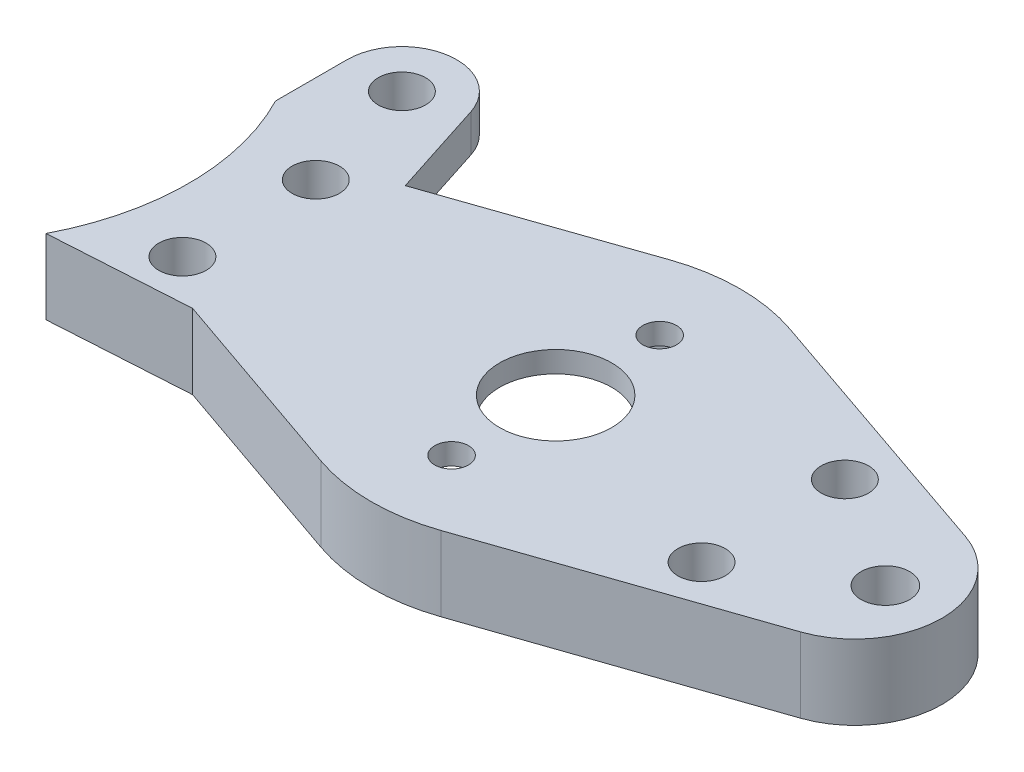
ISO-10303-21;
HEADER;
FILE_DESCRIPTION(('STEP AP214'),'2;1');
FILE_NAME('part.step','',(''),(''),'','','');
FILE_SCHEMA(('AUTOMOTIVE_DESIGN { 1 0 10303 214 1 1 1 1 }'));
ENDSEC;
DATA;
#1=APPLICATION_CONTEXT('core data for automotive mechanical design processes');
#2=APPLICATION_PROTOCOL_DEFINITION('international standard','automotive_design',2000,#1);
#3=PRODUCT_CONTEXT('',#1,'mechanical');
#4=PRODUCT('Part','Part','',(#3));
#5=PRODUCT_RELATED_PRODUCT_CATEGORY('part','',(#4));
#6=PRODUCT_DEFINITION_FORMATION('','',#4);
#7=PRODUCT_DEFINITION_CONTEXT('part definition',#1,'design');
#8=PRODUCT_DEFINITION('design','',#6,#7);
#9=PRODUCT_DEFINITION_SHAPE('','',#8);
#10=(LENGTH_UNIT() NAMED_UNIT(*) SI_UNIT(.MILLI.,.METRE.));
#11=(NAMED_UNIT(*) PLANE_ANGLE_UNIT() SI_UNIT($,.RADIAN.));
#12=(NAMED_UNIT(*) SI_UNIT($,.STERADIAN.) SOLID_ANGLE_UNIT());
#13=UNCERTAINTY_MEASURE_WITH_UNIT(LENGTH_MEASURE(1.E-05),#10,'distance_accuracy_value','');
#14=(GEOMETRIC_REPRESENTATION_CONTEXT(3) GLOBAL_UNCERTAINTY_ASSIGNED_CONTEXT((#13)) GLOBAL_UNIT_ASSIGNED_CONTEXT((#10,
#11,#12)) REPRESENTATION_CONTEXT('',''));
#15=CARTESIAN_POINT('',(0.,0.,0.));
#16=DIRECTION('',(0.,0.,1.));
#17=DIRECTION('',(1.,0.,0.));
#18=AXIS2_PLACEMENT_3D('',#15,#16,#17);
#19=CARTESIAN_POINT('',(0.561103411669848,6.,-9.17395968794899));
#20=DIRECTION('',(0.0610485395348534,0.,-0.998134798421867));
#21=DIRECTION('',(-0.998134798421867,0.,-0.0610485395348534));
#22=AXIS2_PLACEMENT_3D('',#19,#20,#21);
#23=PLANE('',#22);
#24=DIRECTION('',(0.,-1.,0.));
#25=VECTOR('',#24,1.);
#26=CARTESIAN_POINT('',(0.,6.,-9.20827824278209));
#27=LINE('',#26,#25);
#28=CARTESIAN_POINT('',(0.,3.,-9.20827824278209));
#29=VERTEX_POINT('',#28);
#30=CARTESIAN_POINT('',(0.,0.,-9.20827824278209));
#31=VERTEX_POINT('',#30);
#32=EDGE_CURVE('E61',#29,#31,#27,.T.);
#33=ORIENTED_EDGE('',*,*,#32,.F.);
#34=DIRECTION('',(-0.998134798421867,0.,-0.0610485395348534));
#35=VECTOR('',#34,1.);
#36=CARTESIAN_POINT('',(0.561103411669848,3.,-9.17395968794899));
#37=LINE('',#36,#35);
#38=CARTESIAN_POINT('',(11.0897512420707,3.,-8.53));
#39=VERTEX_POINT('',#38);
#40=EDGE_CURVE('E56',#39,#29,#37,.T.);
#41=ORIENTED_EDGE('',*,*,#40,.F.);
#42=DIRECTION('',(0.,-1.,0.));
#43=VECTOR('',#42,1.);
#44=CARTESIAN_POINT('',(11.0897512420707,6.,-8.53));
#45=LINE('',#44,#43);
#46=CARTESIAN_POINT('',(11.0897512420707,0.,-8.53));
#47=VERTEX_POINT('',#46);
#48=EDGE_CURVE('E266',#39,#47,#45,.T.);
#49=ORIENTED_EDGE('',*,*,#48,.T.);
#50=DIRECTION('',(0.998134798421867,0.,0.0610485395348534));
#51=VECTOR('',#50,1.);
#52=CARTESIAN_POINT('',(0.561103411669848,0.,-9.17395968794899));
#53=LINE('',#52,#51);
#54=EDGE_CURVE('E247',#31,#47,#53,.T.);
#55=ORIENTED_EDGE('',*,*,#54,.F.);
#56=EDGE_LOOP('',(#33,#41,#49,#55));
#57=FACE_BOUND('',#56,.T.);
#58=ADVANCED_FACE('F39',(#57),#23,.T.);
#59=CARTESIAN_POINT('',(-17.7540871858709,6.,0.));
#60=DIRECTION('',(0.,-1.,0.));
#61=DIRECTION('',(0.,0.,-1.));
#62=AXIS2_PLACEMENT_3D('',#59,#60,#61);
#63=CYLINDRICAL_SURFACE('',#62,20.);
#64=CARTESIAN_POINT('',(-17.7540871858709,0.,0.));
#65=DIRECTION('',(0.,1.,0.));
#66=DIRECTION('',(0.,0.,1.));
#67=AXIS2_PLACEMENT_3D('',#64,#65,#66);
#68=CIRCLE('',#67,20.);
#69=CARTESIAN_POINT('',(0.,0.,9.20827824278209));
#70=VERTEX_POINT('',#69);
#71=EDGE_CURVE('E191',#70,#31,#68,.T.);
#72=ORIENTED_EDGE('',*,*,#71,.F.);
#73=DIRECTION('',(0.,-1.,0.));
#74=VECTOR('',#73,1.);
#75=CARTESIAN_POINT('',(0.,6.,9.20827824278209));
#76=LINE('',#75,#74);
#77=CARTESIAN_POINT('',(0.,6.,9.20827824278209));
#78=VERTEX_POINT('',#77);
#79=EDGE_CURVE('E12',#78,#70,#76,.T.);
#80=ORIENTED_EDGE('',*,*,#79,.F.);
#81=CARTESIAN_POINT('',(-17.7540871858709,6.,0.));
#82=DIRECTION('',(0.,1.,0.));
#83=DIRECTION('',(0.,0.,1.));
#84=AXIS2_PLACEMENT_3D('',#81,#82,#83);
#85=CIRCLE('',#84,20.);
#86=CARTESIAN_POINT('',(0.,6.,-9.20827824278209));
#87=VERTEX_POINT('',#86);
#88=EDGE_CURVE('E192',#78,#87,#85,.T.);
#89=ORIENTED_EDGE('',*,*,#88,.T.);
#90=EDGE_CURVE('E264',#87,#29,#27,.T.);
#91=ORIENTED_EDGE('',*,*,#90,.T.);
#92=ORIENTED_EDGE('',*,*,#32,.T.);
#93=EDGE_LOOP('',(#72,#80,#89,#91,#92));
#94=FACE_BOUND('',#93,.T.);
#95=ADVANCED_FACE('F41',(#94),#63,.F.);
#96=CARTESIAN_POINT('',(0.561103411669848,6.,9.17395968794899));
#97=DIRECTION('',(-0.0610485395348534,0.,-0.998134798421867));
#98=DIRECTION('',(-0.998134798421867,0.,0.0610485395348534));
#99=AXIS2_PLACEMENT_3D('',#96,#97,#98);
#100=PLANE('',#99);
#101=DIRECTION('',(0.998134798421867,0.,-0.0610485395348534));
#102=VECTOR('',#101,1.);
#103=CARTESIAN_POINT('',(0.561103411669848,0.,9.17395968794899));
#104=LINE('',#103,#102);
#105=CARTESIAN_POINT('',(11.0897512420707,0.,8.53));
#106=VERTEX_POINT('',#105);
#107=EDGE_CURVE('E229',#70,#106,#104,.T.);
#108=ORIENTED_EDGE('',*,*,#107,.T.);
#109=DIRECTION('',(0.,-1.,0.));
#110=VECTOR('',#109,1.);
#111=CARTESIAN_POINT('',(11.0897512420707,6.,8.53));
#112=LINE('',#111,#110);
#113=CARTESIAN_POINT('',(11.0897512420707,6.,8.53));
#114=VERTEX_POINT('',#113);
#115=EDGE_CURVE('E48',#114,#106,#112,.T.);
#116=ORIENTED_EDGE('',*,*,#115,.F.);
#117=DIRECTION('',(0.998134798421867,0.,-0.0610485395348534));
#118=VECTOR('',#117,1.);
#119=CARTESIAN_POINT('',(0.561103411669848,6.,9.17395968794899));
#120=LINE('',#119,#118);
#121=EDGE_CURVE('E194',#78,#114,#120,.T.);
#122=ORIENTED_EDGE('',*,*,#121,.F.);
#123=ORIENTED_EDGE('',*,*,#79,.T.);
#124=EDGE_LOOP('',(#108,#116,#122,#123));
#125=FACE_BOUND('',#124,.T.);
#126=ADVANCED_FACE('F323',(#125),#100,.F.);
#127=CARTESIAN_POINT('',(-1.45012508052233,6.,4.18860734354893));
#128=DIRECTION('',(0.327155397221724,0.,-0.944970553016704));
#129=DIRECTION('',(-0.944970553016705,0.,-0.327155397221724));
#130=AXIS2_PLACEMENT_3D('',#127,#128,#129);
#131=PLANE('',#130);
#132=DIRECTION('',(0.944970553016704,0.,0.327155397221724));
#133=VECTOR('',#132,1.);
#134=CARTESIAN_POINT('',(-1.45012508052233,0.,4.18860734354893));
#135=LINE('',#134,#133);
#136=CARTESIAN_POINT('',(26.8478513631892,0.,13.9855641846472));
#137=VERTEX_POINT('',#136);
#138=EDGE_CURVE('E231',#106,#137,#135,.T.);
#139=ORIENTED_EDGE('',*,*,#138,.T.);
#140=DIRECTION('',(0.,-1.,0.));
#141=VECTOR('',#140,1.);
#142=CARTESIAN_POINT('',(26.8478513631892,6.,13.9855641846472));
#143=LINE('',#142,#141);
#144=CARTESIAN_POINT('',(26.8478513631892,6.,13.9855641846472));
#145=VERTEX_POINT('',#144);
#146=EDGE_CURVE('E280',#145,#137,#143,.T.);
#147=ORIENTED_EDGE('',*,*,#146,.F.);
#148=DIRECTION('',(0.944970553016704,0.,0.327155397221724));
#149=VECTOR('',#148,1.);
#150=CARTESIAN_POINT('',(-1.45012508052233,6.,4.18860734354893));
#151=LINE('',#150,#149);
#152=EDGE_CURVE('E197',#114,#145,#151,.T.);
#153=ORIENTED_EDGE('',*,*,#152,.F.);
#154=ORIENTED_EDGE('',*,*,#115,.T.);
#155=EDGE_LOOP('',(#139,#147,#153,#154));
#156=FACE_BOUND('',#155,.T.);
#157=ADVANCED_FACE('F351',(#156),#131,.F.);
#158=CARTESIAN_POINT('',(31.6897512420707,6.,0.));
#159=DIRECTION('',(0.,-1.,0.));
#160=DIRECTION('',(0.,0.,-1.));
#161=AXIS2_PLACEMENT_3D('',#158,#159,#160);
#162=CYLINDRICAL_SURFACE('',#161,14.8);
#163=CARTESIAN_POINT('',(31.6897512420707,0.,0.));
#164=DIRECTION('',(0.,1.,0.));
#165=DIRECTION('',(0.,0.,1.));
#166=AXIS2_PLACEMENT_3D('',#163,#164,#165);
#167=CIRCLE('',#166,14.8);
#168=CARTESIAN_POINT('',(36.4997512420707,0.,13.9965674363395));
#169=VERTEX_POINT('',#168);
#170=EDGE_CURVE('E233',#137,#169,#167,.T.);
#171=ORIENTED_EDGE('',*,*,#170,.T.);
#172=DIRECTION('',(0.,-1.,0.));
#173=VECTOR('',#172,1.);
#174=CARTESIAN_POINT('',(36.4997512420707,6.,13.9965674363395));
#175=LINE('',#174,#173);
#176=CARTESIAN_POINT('',(36.4997512420707,6.,13.9965674363395));
#177=VERTEX_POINT('',#176);
#178=EDGE_CURVE('E277',#177,#169,#175,.T.);
#179=ORIENTED_EDGE('',*,*,#178,.F.);
#180=CARTESIAN_POINT('',(31.6897512420707,6.,0.));
#181=DIRECTION('',(0.,1.,0.));
#182=DIRECTION('',(0.,0.,1.));
#183=AXIS2_PLACEMENT_3D('',#180,#181,#182);
#184=CIRCLE('',#183,14.8);
#185=EDGE_CURVE('E199',#145,#177,#184,.T.);
#186=ORIENTED_EDGE('',*,*,#185,.F.);
#187=ORIENTED_EDGE('',*,*,#146,.T.);
#188=EDGE_LOOP('',(#171,#179,#186,#187));
#189=FACE_BOUND('',#188,.T.);
#190=ADVANCED_FACE('F339',(#189),#162,.T.);
#191=CARTESIAN_POINT('',(8.15722997494371,6.,23.7366360578025));
#192=DIRECTION('',(-0.325,0.,-0.945714015968887));
#193=DIRECTION('',(-0.945714015968887,0.,0.325));
#194=AXIS2_PLACEMENT_3D('',#191,#192,#193);
#195=PLANE('',#194);
#196=DIRECTION('',(0.945714015968887,0.,-0.325));
#197=VECTOR('',#196,1.);
#198=CARTESIAN_POINT('',(8.15722997494371,0.,23.7366360578025));
#199=LINE('',#198,#197);
#200=CARTESIAN_POINT('',(57.9647512420707,0.,6.6199981117822));
#201=VERTEX_POINT('',#200);
#202=EDGE_CURVE('E235',#169,#201,#199,.T.);
#203=ORIENTED_EDGE('',*,*,#202,.T.);
#204=DIRECTION('',(0.,-1.,0.));
#205=VECTOR('',#204,1.);
#206=CARTESIAN_POINT('',(57.9647512420707,6.,6.6199981117822));
#207=LINE('',#206,#205);
#208=CARTESIAN_POINT('',(57.9647512420707,6.,6.6199981117822));
#209=VERTEX_POINT('',#208);
#210=EDGE_CURVE('E274',#209,#201,#207,.T.);
#211=ORIENTED_EDGE('',*,*,#210,.F.);
#212=DIRECTION('',(0.945714015968887,0.,-0.325));
#213=VECTOR('',#212,1.);
#214=CARTESIAN_POINT('',(8.15722997494371,6.,23.7366360578025));
#215=LINE('',#214,#213);
#216=EDGE_CURVE('E201',#177,#209,#215,.T.);
#217=ORIENTED_EDGE('',*,*,#216,.F.);
#218=ORIENTED_EDGE('',*,*,#178,.T.);
#219=EDGE_LOOP('',(#203,#211,#217,#218));
#220=FACE_BOUND('',#219,.T.);
#221=ADVANCED_FACE('F346',(#220),#195,.F.);
#222=CARTESIAN_POINT('',(55.6897512420707,6.,0.));
#223=DIRECTION('',(0.,-1.,0.));
#224=DIRECTION('',(0.,0.,-1.));
#225=AXIS2_PLACEMENT_3D('',#222,#223,#224);
#226=CYLINDRICAL_SURFACE('',#225,6.99999999999999);
#227=CARTESIAN_POINT('',(55.6897512420707,0.,0.));
#228=DIRECTION('',(0.,1.,0.));
#229=DIRECTION('',(0.,0.,1.));
#230=AXIS2_PLACEMENT_3D('',#227,#228,#229);
#231=CIRCLE('',#230,6.99999999999999);
#232=CARTESIAN_POINT('',(57.9647512420707,0.,-6.6199981117822));
#233=VERTEX_POINT('',#232);
#234=EDGE_CURVE('E238',#201,#233,#231,.T.);
#235=ORIENTED_EDGE('',*,*,#234,.T.);
#236=DIRECTION('',(0.,-1.,0.));
#237=VECTOR('',#236,1.);
#238=CARTESIAN_POINT('',(57.9647512420707,6.,-6.6199981117822));
#239=LINE('',#238,#237);
#240=CARTESIAN_POINT('',(57.9647512420707,6.,-6.6199981117822));
#241=VERTEX_POINT('',#240);
#242=EDGE_CURVE('E272',#241,#233,#239,.T.);
#243=ORIENTED_EDGE('',*,*,#242,.F.);
#244=CARTESIAN_POINT('',(55.6897512420707,6.,0.));
#245=DIRECTION('',(0.,1.,0.));
#246=DIRECTION('',(0.,0.,1.));
#247=AXIS2_PLACEMENT_3D('',#244,#245,#246);
#248=CIRCLE('',#247,6.99999999999999);
#249=EDGE_CURVE('E204',#209,#241,#248,.T.);
#250=ORIENTED_EDGE('',*,*,#249,.F.);
#251=ORIENTED_EDGE('',*,*,#210,.T.);
#252=EDGE_LOOP('',(#235,#243,#250,#251));
#253=FACE_BOUND('',#252,.T.);
#254=ADVANCED_FACE('F342',(#253),#226,.T.);
#255=CARTESIAN_POINT('',(8.15722997494372,6.,-23.7366360578025));
#256=DIRECTION('',(0.325,0.,-0.945714015968887));
#257=DIRECTION('',(-0.945714015968887,0.,-0.325));
#258=AXIS2_PLACEMENT_3D('',#255,#256,#257);
#259=PLANE('',#258);
#260=DIRECTION('',(0.945714015968887,0.,0.325));
#261=VECTOR('',#260,1.);
#262=CARTESIAN_POINT('',(8.15722997494372,0.,-23.7366360578025));
#263=LINE('',#262,#261);
#264=CARTESIAN_POINT('',(36.4997512420707,0.,-13.9965674363395));
#265=VERTEX_POINT('',#264);
#266=EDGE_CURVE('E241',#265,#233,#263,.T.);
#267=ORIENTED_EDGE('',*,*,#266,.F.);
#268=DIRECTION('',(0.,-1.,0.));
#269=VECTOR('',#268,1.);
#270=CARTESIAN_POINT('',(36.4997512420707,6.,-13.9965674363395));
#271=LINE('',#270,#269);
#272=CARTESIAN_POINT('',(36.4997512420707,6.,-13.9965674363395));
#273=VERTEX_POINT('',#272);
#274=EDGE_CURVE('E270',#273,#265,#271,.T.);
#275=ORIENTED_EDGE('',*,*,#274,.F.);
#276=DIRECTION('',(0.945714015968887,0.,0.325));
#277=VECTOR('',#276,1.);
#278=CARTESIAN_POINT('',(8.15722997494372,6.,-23.7366360578025));
#279=LINE('',#278,#277);
#280=EDGE_CURVE('E206',#273,#241,#279,.T.);
#281=ORIENTED_EDGE('',*,*,#280,.T.);
#282=ORIENTED_EDGE('',*,*,#242,.T.);
#283=EDGE_LOOP('',(#267,#275,#281,#282));
#284=FACE_BOUND('',#283,.T.);
#285=ADVANCED_FACE('F337',(#284),#259,.T.);
#286=CARTESIAN_POINT('',(26.8478513631892,0.,-13.9855641846472));
#287=VERTEX_POINT('',#286);
#288=EDGE_CURVE('E236',#265,#287,#167,.T.);
#289=ORIENTED_EDGE('',*,*,#288,.T.);
#290=DIRECTION('',(0.,-1.,0.));
#291=VECTOR('',#290,1.);
#292=CARTESIAN_POINT('',(26.8478513631892,6.,-13.9855641846472));
#293=LINE('',#292,#291);
#294=CARTESIAN_POINT('',(26.8478513631892,6.,-13.9855641846472));
#295=VERTEX_POINT('',#294);
#296=EDGE_CURVE('E268',#295,#287,#293,.T.);
#297=ORIENTED_EDGE('',*,*,#296,.F.);
#298=EDGE_CURVE('E202',#273,#295,#184,.T.);
#299=ORIENTED_EDGE('',*,*,#298,.F.);
#300=ORIENTED_EDGE('',*,*,#274,.T.);
#301=EDGE_LOOP('',(#289,#297,#299,#300));
#302=FACE_BOUND('',#301,.T.);
#303=ADVANCED_FACE('F333',(#302),#162,.T.);
#304=CARTESIAN_POINT('',(-1.45012508052233,6.,-4.18860734354893));
#305=DIRECTION('',(-0.327155397221724,0.,-0.944970553016704));
#306=DIRECTION('',(-0.944970553016705,0.,0.327155397221724));
#307=AXIS2_PLACEMENT_3D('',#304,#305,#306);
#308=PLANE('',#307);
#309=DIRECTION('',(0.944970553016704,0.,-0.327155397221724));
#310=VECTOR('',#309,1.);
#311=CARTESIAN_POINT('',(-1.45012508052233,0.,-4.18860734354893));
#312=LINE('',#311,#310);
#313=EDGE_CURVE('E244',#47,#287,#312,.T.);
#314=ORIENTED_EDGE('',*,*,#313,.F.);
#315=ORIENTED_EDGE('',*,*,#48,.F.);
#316=CARTESIAN_POINT('',(11.0897512420707,6.,-8.53));
#317=VERTEX_POINT('',#316);
#318=EDGE_CURVE('E157',#317,#39,#45,.T.);
#319=ORIENTED_EDGE('',*,*,#318,.F.);
#320=DIRECTION('',(0.944970553016704,0.,-0.327155397221724));
#321=VECTOR('',#320,1.);
#322=CARTESIAN_POINT('',(-1.45012508052233,6.,-4.18860734354893));
#323=LINE('',#322,#321);
#324=EDGE_CURVE('E209',#317,#295,#323,.T.);
#325=ORIENTED_EDGE('',*,*,#324,.T.);
#326=ORIENTED_EDGE('',*,*,#296,.T.);
#327=EDGE_LOOP('',(#314,#315,#319,#325,#326));
#328=FACE_BOUND('',#327,.T.);
#329=ADVANCED_FACE('F329',(#328),#308,.T.);
#330=CARTESIAN_POINT('',(49.1476808595097,6.,5.75));
#331=DIRECTION('',(0.,-1.,0.));
#332=DIRECTION('',(0.,0.,-1.));
#333=AXIS2_PLACEMENT_3D('',#330,#331,#332);
#334=CYLINDRICAL_SURFACE('',#333,1.9);
#335=CARTESIAN_POINT('',(49.1476808595097,6.,5.75));
#336=DIRECTION('',(0.,1.,0.));
#337=DIRECTION('',(0.,0.,1.));
#338=AXIS2_PLACEMENT_3D('',#335,#336,#337);
#339=CIRCLE('',#338,1.9);
#340=CARTESIAN_POINT('',(49.1476808595097,6.,7.65));
#341=VERTEX_POINT('',#340);
#342=EDGE_CURVE('E221',#341,#341,#339,.T.);
#343=ORIENTED_EDGE('',*,*,#342,.T.);
#344=EDGE_LOOP('',(#343));
#345=FACE_BOUND('',#344,.T.);
#346=CARTESIAN_POINT('',(49.1476808595097,0.,5.75));
#347=DIRECTION('',(0.,1.,0.));
#348=DIRECTION('',(0.,0.,1.));
#349=AXIS2_PLACEMENT_3D('',#346,#347,#348);
#350=CIRCLE('',#349,1.9);
#351=CARTESIAN_POINT('',(49.1476808595097,0.,7.65));
#352=VERTEX_POINT('',#351);
#353=EDGE_CURVE('E259',#352,#352,#350,.T.);
#354=ORIENTED_EDGE('',*,*,#353,.F.);
#355=EDGE_LOOP('',(#354));
#356=FACE_BOUND('',#355,.T.);
#357=ADVANCED_FACE('F332',(#345,#356),#334,.F.);
#358=CARTESIAN_POINT('',(58.1476808595097,6.,0.));
#359=DIRECTION('',(0.,-1.,0.));
#360=DIRECTION('',(0.,0.,-1.));
#361=AXIS2_PLACEMENT_3D('',#358,#359,#360);
#362=CYLINDRICAL_SURFACE('',#361,1.95);
#363=CARTESIAN_POINT('',(58.1476808595097,6.,0.));
#364=DIRECTION('',(0.,1.,0.));
#365=DIRECTION('',(0.,0.,1.));
#366=AXIS2_PLACEMENT_3D('',#363,#364,#365);
#367=CIRCLE('',#366,1.95);
#368=CARTESIAN_POINT('',(58.1476808595097,6.,1.95));
#369=VERTEX_POINT('',#368);
#370=EDGE_CURVE('E218',#369,#369,#367,.T.);
#371=ORIENTED_EDGE('',*,*,#370,.T.);
#372=EDGE_LOOP('',(#371));
#373=FACE_BOUND('',#372,.T.);
#374=CARTESIAN_POINT('',(58.1476808595097,0.,0.));
#375=DIRECTION('',(0.,1.,0.));
#376=DIRECTION('',(0.,0.,1.));
#377=AXIS2_PLACEMENT_3D('',#374,#375,#376);
#378=CIRCLE('',#377,1.95);
#379=CARTESIAN_POINT('',(58.1476808595097,0.,1.95));
#380=VERTEX_POINT('',#379);
#381=EDGE_CURVE('E256',#380,#380,#378,.T.);
#382=ORIENTED_EDGE('',*,*,#381,.F.);
#383=EDGE_LOOP('',(#382));
#384=FACE_BOUND('',#383,.T.);
#385=ADVANCED_FACE('F432',(#373,#384),#362,.F.);
#386=CARTESIAN_POINT('',(7.08975124207074,6.,5.35));
#387=DIRECTION('',(0.,-1.,0.));
#388=DIRECTION('',(0.,0.,-1.));
#389=AXIS2_PLACEMENT_3D('',#386,#387,#388);
#390=CYLINDRICAL_SURFACE('',#389,1.9);
#391=CARTESIAN_POINT('',(7.08975124207074,6.,5.35));
#392=DIRECTION('',(0.,1.,0.));
#393=DIRECTION('',(0.,0.,1.));
#394=AXIS2_PLACEMENT_3D('',#391,#392,#393);
#395=CIRCLE('',#394,1.9);
#396=CARTESIAN_POINT('',(7.08975124207074,6.,7.25));
#397=VERTEX_POINT('',#396);
#398=EDGE_CURVE('E215',#397,#397,#395,.T.);
#399=ORIENTED_EDGE('',*,*,#398,.T.);
#400=EDGE_LOOP('',(#399));
#401=FACE_BOUND('',#400,.T.);
#402=CARTESIAN_POINT('',(7.08975124207074,0.,5.35));
#403=DIRECTION('',(0.,1.,0.));
#404=DIRECTION('',(0.,0.,1.));
#405=AXIS2_PLACEMENT_3D('',#402,#403,#404);
#406=CIRCLE('',#405,1.9);
#407=CARTESIAN_POINT('',(7.08975124207074,0.,7.25));
#408=VERTEX_POINT('',#407);
#409=EDGE_CURVE('E253',#408,#408,#406,.T.);
#410=ORIENTED_EDGE('',*,*,#409,.F.);
#411=EDGE_LOOP('',(#410));
#412=FACE_BOUND('',#411,.T.);
#413=ADVANCED_FACE('F435',(#401,#412),#390,.F.);
#414=CARTESIAN_POINT('',(7.08975124207074,6.,-5.35));
#415=DIRECTION('',(0.,-1.,0.));
#416=DIRECTION('',(0.,0.,-1.));
#417=AXIS2_PLACEMENT_3D('',#414,#415,#416);
#418=CYLINDRICAL_SURFACE('',#417,1.9);
#419=CARTESIAN_POINT('',(7.08975124207074,6.,-5.35));
#420=DIRECTION('',(0.,1.,0.));
#421=DIRECTION('',(0.,0.,1.));
#422=AXIS2_PLACEMENT_3D('',#419,#420,#421);
#423=CIRCLE('',#422,1.9);
#424=CARTESIAN_POINT('',(7.08975124207074,6.,-3.45));
#425=VERTEX_POINT('',#424);
#426=EDGE_CURVE('E212',#425,#425,#423,.T.);
#427=ORIENTED_EDGE('',*,*,#426,.T.);
#428=EDGE_LOOP('',(#427));
#429=FACE_BOUND('',#428,.T.);
#430=CARTESIAN_POINT('',(7.08975124207074,0.,-5.35));
#431=DIRECTION('',(0.,1.,0.));
#432=DIRECTION('',(0.,0.,1.));
#433=AXIS2_PLACEMENT_3D('',#430,#431,#432);
#434=CIRCLE('',#433,1.9);
#435=CARTESIAN_POINT('',(7.08975124207074,0.,-3.45));
#436=VERTEX_POINT('',#435);
#437=EDGE_CURVE('E250',#436,#436,#434,.T.);
#438=ORIENTED_EDGE('',*,*,#437,.F.);
#439=EDGE_LOOP('',(#438));
#440=FACE_BOUND('',#439,.T.);
#441=ADVANCED_FACE('F327',(#429,#440),#418,.F.);
#442=CARTESIAN_POINT('',(49.1476808595097,6.,-5.75));
#443=DIRECTION('',(0.,-1.,0.));
#444=DIRECTION('',(0.,0.,-1.));
#445=AXIS2_PLACEMENT_3D('',#442,#443,#444);
#446=CYLINDRICAL_SURFACE('',#445,1.9);
#447=CARTESIAN_POINT('',(49.1476808595097,6.,-5.75));
#448=DIRECTION('',(0.,1.,0.));
#449=DIRECTION('',(0.,0.,1.));
#450=AXIS2_PLACEMENT_3D('',#447,#448,#449);
#451=CIRCLE('',#450,1.9);
#452=CARTESIAN_POINT('',(49.1476808595097,6.,-3.85));
#453=VERTEX_POINT('',#452);
#454=EDGE_CURVE('E224',#453,#453,#451,.T.);
#455=ORIENTED_EDGE('',*,*,#454,.T.);
#456=EDGE_LOOP('',(#455));
#457=FACE_BOUND('',#456,.T.);
#458=CARTESIAN_POINT('',(49.1476808595097,0.,-5.75));
#459=DIRECTION('',(0.,1.,0.));
#460=DIRECTION('',(0.,0.,1.));
#461=AXIS2_PLACEMENT_3D('',#458,#459,#460);
#462=CIRCLE('',#461,1.9);
#463=CARTESIAN_POINT('',(49.1476808595097,0.,-3.85));
#464=VERTEX_POINT('',#463);
#465=EDGE_CURVE('E195',#464,#464,#462,.T.);
#466=ORIENTED_EDGE('',*,*,#465,.F.);
#467=EDGE_LOOP('',(#466));
#468=FACE_BOUND('',#467,.T.);
#469=ADVANCED_FACE('F419',(#457,#468),#446,.F.);
#470=CARTESIAN_POINT('',(0.,6.,0.));
#471=DIRECTION('',(0.,1.,0.));
#472=DIRECTION('',(0.,0.,1.));
#473=AXIS2_PLACEMENT_3D('',#470,#471,#472);
#474=PLANE('',#473);
#475=CARTESIAN_POINT('',(31.6897512420707,6.,-8.35));
#476=DIRECTION('',(0.,1.,0.));
#477=DIRECTION('',(0.,0.,1.));
#478=AXIS2_PLACEMENT_3D('',#475,#476,#477);
#479=CIRCLE('',#478,1.35000000000001);
#480=CARTESIAN_POINT('',(31.6897512420707,6.,-6.99999999999999));
#481=VERTEX_POINT('',#480);
#482=EDGE_CURVE('E176',#481,#481,#479,.T.);
#483=ORIENTED_EDGE('',*,*,#482,.F.);
#484=EDGE_LOOP('',(#483));
#485=FACE_BOUND('',#484,.T.);
#486=CARTESIAN_POINT('',(31.6897512420707,6.,8.35));
#487=DIRECTION('',(0.,1.,0.));
#488=DIRECTION('',(0.,0.,1.));
#489=AXIS2_PLACEMENT_3D('',#486,#487,#488);
#490=CIRCLE('',#489,1.35);
#491=CARTESIAN_POINT('',(31.6897512420707,6.,9.7));
#492=VERTEX_POINT('',#491);
#493=EDGE_CURVE('E180',#492,#492,#490,.T.);
#494=ORIENTED_EDGE('',*,*,#493,.F.);
#495=EDGE_LOOP('',(#494));
#496=FACE_BOUND('',#495,.T.);
#497=CARTESIAN_POINT('',(31.6897512420707,6.,0.));
#498=DIRECTION('',(0.,1.,0.));
#499=DIRECTION('',(0.,0.,1.));
#500=AXIS2_PLACEMENT_3D('',#497,#498,#499);
#501=CIRCLE('',#500,4.5);
#502=CARTESIAN_POINT('',(31.6897512420707,6.,4.5));
#503=VERTEX_POINT('',#502);
#504=EDGE_CURVE('E174',#503,#503,#501,.T.);
#505=ORIENTED_EDGE('',*,*,#504,.F.);
#506=EDGE_LOOP('',(#505));
#507=FACE_BOUND('',#506,.T.);
#508=ORIENTED_EDGE('',*,*,#88,.F.);
#509=ORIENTED_EDGE('',*,*,#121,.T.);
#510=ORIENTED_EDGE('',*,*,#152,.T.);
#511=ORIENTED_EDGE('',*,*,#185,.T.);
#512=ORIENTED_EDGE('',*,*,#216,.T.);
#513=ORIENTED_EDGE('',*,*,#249,.T.);
#514=ORIENTED_EDGE('',*,*,#280,.F.);
#515=ORIENTED_EDGE('',*,*,#298,.T.);
#516=ORIENTED_EDGE('',*,*,#324,.F.);
#517=DIRECTION('',(-0.306492189661265,0.,-0.951873173104823));
#518=VECTOR('',#517,1.);
#519=CARTESIAN_POINT('',(12.5365647947765,6.,-4.03662935709005));
#520=LINE('',#519,#518);
#521=CARTESIAN_POINT('',(8.58824196166122,6.,-16.2989404709666));
#522=VERTEX_POINT('',#521);
#523=EDGE_CURVE('E169',#317,#522,#520,.T.);
#524=ORIENTED_EDGE('',*,*,#523,.T.);
#525=CARTESIAN_POINT('',(4.4,6.,-14.9503748364571));
#526=DIRECTION('',(0.,1.,0.));
#527=DIRECTION('',(0.,0.,1.));
#528=AXIS2_PLACEMENT_3D('',#525,#526,#527);
#529=CIRCLE('',#528,4.4);
#530=CARTESIAN_POINT('',(0.,6.,-14.9503748364571));
#531=VERTEX_POINT('',#530);
#532=EDGE_CURVE('E139',#522,#531,#529,.T.);
#533=ORIENTED_EDGE('',*,*,#532,.T.);
#534=DIRECTION('',(0.,0.,-1.));
#535=VECTOR('',#534,1.);
#536=CARTESIAN_POINT('',(0.,6.,0.));
#537=LINE('',#536,#535);
#538=EDGE_CURVE('E161',#87,#531,#537,.T.);
#539=ORIENTED_EDGE('',*,*,#538,.F.);
#540=EDGE_LOOP('',(#508,#509,#510,#511,#512,#513,#514,#515,#516,#524,#533,#539));
#541=FACE_BOUND('',#540,.T.);
#542=ORIENTED_EDGE('',*,*,#426,.F.);
#543=EDGE_LOOP('',(#542));
#544=FACE_BOUND('',#543,.T.);
#545=ORIENTED_EDGE('',*,*,#398,.F.);
#546=EDGE_LOOP('',(#545));
#547=FACE_BOUND('',#546,.T.);
#548=ORIENTED_EDGE('',*,*,#370,.F.);
#549=EDGE_LOOP('',(#548));
#550=FACE_BOUND('',#549,.T.);
#551=ORIENTED_EDGE('',*,*,#342,.F.);
#552=EDGE_LOOP('',(#551));
#553=FACE_BOUND('',#552,.T.);
#554=ORIENTED_EDGE('',*,*,#454,.F.);
#555=EDGE_LOOP('',(#554));
#556=FACE_BOUND('',#555,.T.);
#557=CARTESIAN_POINT('',(4.4,6.,-14.9503748364571));
#558=DIRECTION('',(0.,1.,0.));
#559=DIRECTION('',(0.,0.,1.));
#560=AXIS2_PLACEMENT_3D('',#557,#558,#559);
#561=CIRCLE('',#560,1.9);
#562=CARTESIAN_POINT('',(4.4,6.,-13.0503748364571));
#563=VERTEX_POINT('',#562);
#564=EDGE_CURVE('E166',#563,#563,#561,.T.);
#565=ORIENTED_EDGE('',*,*,#564,.F.);
#566=EDGE_LOOP('',(#565));
#567=FACE_BOUND('',#566,.T.);
#568=ADVANCED_FACE('F313',(#485,#496,#507,#541,#544,#547,#550,#553,#556,#567),#474,.T.);
#569=CARTESIAN_POINT('',(0.,0.,0.));
#570=DIRECTION('',(0.,1.,0.));
#571=DIRECTION('',(0.,0.,1.));
#572=AXIS2_PLACEMENT_3D('',#569,#570,#571);
#573=PLANE('',#572);
#574=CARTESIAN_POINT('',(31.6897512420707,0.,0.));
#575=DIRECTION('',(0.,1.,0.));
#576=DIRECTION('',(0.,0.,1.));
#577=AXIS2_PLACEMENT_3D('',#574,#575,#576);
#578=CIRCLE('',#577,12.3);
#579=CARTESIAN_POINT('',(31.6897512420707,0.,12.3));
#580=VERTEX_POINT('',#579);
#581=EDGE_CURVE('E185',#580,#580,#578,.T.);
#582=ORIENTED_EDGE('',*,*,#581,.T.);
#583=EDGE_LOOP('',(#582));
#584=FACE_BOUND('',#583,.T.);
#585=ORIENTED_EDGE('',*,*,#71,.T.);
#586=ORIENTED_EDGE('',*,*,#54,.T.);
#587=ORIENTED_EDGE('',*,*,#313,.T.);
#588=ORIENTED_EDGE('',*,*,#288,.F.);
#589=ORIENTED_EDGE('',*,*,#266,.T.);
#590=ORIENTED_EDGE('',*,*,#234,.F.);
#591=ORIENTED_EDGE('',*,*,#202,.F.);
#592=ORIENTED_EDGE('',*,*,#170,.F.);
#593=ORIENTED_EDGE('',*,*,#138,.F.);
#594=ORIENTED_EDGE('',*,*,#107,.F.);
#595=EDGE_LOOP('',(#585,#586,#587,#588,#589,#590,#591,#592,#593,#594));
#596=FACE_BOUND('',#595,.T.);
#597=ORIENTED_EDGE('',*,*,#437,.T.);
#598=EDGE_LOOP('',(#597));
#599=FACE_BOUND('',#598,.T.);
#600=ORIENTED_EDGE('',*,*,#409,.T.);
#601=EDGE_LOOP('',(#600));
#602=FACE_BOUND('',#601,.T.);
#603=ORIENTED_EDGE('',*,*,#381,.T.);
#604=EDGE_LOOP('',(#603));
#605=FACE_BOUND('',#604,.T.);
#606=ORIENTED_EDGE('',*,*,#353,.T.);
#607=EDGE_LOOP('',(#606));
#608=FACE_BOUND('',#607,.T.);
#609=ORIENTED_EDGE('',*,*,#465,.T.);
#610=EDGE_LOOP('',(#609));
#611=FACE_BOUND('',#610,.T.);
#612=ADVANCED_FACE('F307',(#584,#596,#599,#602,#605,#608,#611),#573,.F.);
#613=CARTESIAN_POINT('',(31.6897512420707,40.7896536343781,0.));
#614=DIRECTION('',(0.,-1.,0.));
#615=DIRECTION('',(0.,0.,-1.));
#616=AXIS2_PLACEMENT_3D('',#613,#614,#615);
#617=CYLINDRICAL_SURFACE('',#616,12.3);
#618=ORIENTED_EDGE('',*,*,#581,.F.);
#619=EDGE_LOOP('',(#618));
#620=FACE_BOUND('',#619,.T.);
#621=CARTESIAN_POINT('',(31.6897512420707,4.3,0.));
#622=DIRECTION('',(0.,1.,0.));
#623=DIRECTION('',(0.,0.,1.));
#624=AXIS2_PLACEMENT_3D('',#621,#622,#623);
#625=CIRCLE('',#624,12.3);
#626=CARTESIAN_POINT('',(31.6897512420707,4.3,12.3));
#627=VERTEX_POINT('',#626);
#628=EDGE_CURVE('E188',#627,#627,#625,.T.);
#629=ORIENTED_EDGE('',*,*,#628,.T.);
#630=EDGE_LOOP('',(#629));
#631=FACE_BOUND('',#630,.T.);
#632=ADVANCED_FACE('F299',(#620,#631),#617,.F.);
#633=CARTESIAN_POINT('',(0.,4.3,0.));
#634=DIRECTION('',(0.,1.,0.));
#635=DIRECTION('',(0.,0.,1.));
#636=AXIS2_PLACEMENT_3D('',#633,#634,#635);
#637=PLANE('',#636);
#638=CARTESIAN_POINT('',(31.6897512420707,4.3,-8.35));
#639=DIRECTION('',(0.,1.,0.));
#640=DIRECTION('',(0.,0.,1.));
#641=AXIS2_PLACEMENT_3D('',#638,#639,#640);
#642=CIRCLE('',#641,1.35000000000001);
#643=CARTESIAN_POINT('',(31.6897512420707,4.3,-6.99999999999999));
#644=VERTEX_POINT('',#643);
#645=EDGE_CURVE('E43',#644,#644,#642,.F.);
#646=ORIENTED_EDGE('',*,*,#645,.F.);
#647=EDGE_LOOP('',(#646));
#648=FACE_BOUND('',#647,.T.);
#649=CARTESIAN_POINT('',(31.6897512420707,4.3,8.35));
#650=DIRECTION('',(0.,1.,0.));
#651=DIRECTION('',(0.,0.,1.));
#652=AXIS2_PLACEMENT_3D('',#649,#650,#651);
#653=CIRCLE('',#652,1.35);
#654=CARTESIAN_POINT('',(31.6897512420707,4.3,9.7));
#655=VERTEX_POINT('',#654);
#656=EDGE_CURVE('E286',#655,#655,#653,.F.);
#657=ORIENTED_EDGE('',*,*,#656,.F.);
#658=EDGE_LOOP('',(#657));
#659=FACE_BOUND('',#658,.T.);
#660=CARTESIAN_POINT('',(31.6897512420707,4.3,0.));
#661=DIRECTION('',(0.,1.,0.));
#662=DIRECTION('',(0.,0.,1.));
#663=AXIS2_PLACEMENT_3D('',#660,#661,#662);
#664=CIRCLE('',#663,4.5);
#665=CARTESIAN_POINT('',(31.6897512420707,4.3,4.5));
#666=VERTEX_POINT('',#665);
#667=EDGE_CURVE('E179',#666,#666,#664,.F.);
#668=ORIENTED_EDGE('',*,*,#667,.F.);
#669=EDGE_LOOP('',(#668));
#670=FACE_BOUND('',#669,.T.);
#671=ORIENTED_EDGE('',*,*,#628,.F.);
#672=EDGE_LOOP('',(#671));
#673=FACE_BOUND('',#672,.T.);
#674=ADVANCED_FACE('F295',(#648,#659,#670,#673),#637,.F.);
#675=CARTESIAN_POINT('',(31.6897512420707,18.7279220613579,0.));
#676=DIRECTION('',(0.,-1.,0.));
#677=DIRECTION('',(0.,0.,-1.));
#678=AXIS2_PLACEMENT_3D('',#675,#676,#677);
#679=CYLINDRICAL_SURFACE('',#678,4.5);
#680=ORIENTED_EDGE('',*,*,#504,.T.);
#681=EDGE_LOOP('',(#680));
#682=FACE_BOUND('',#681,.T.);
#683=ORIENTED_EDGE('',*,*,#667,.T.);
#684=EDGE_LOOP('',(#683));
#685=FACE_BOUND('',#684,.T.);
#686=ADVANCED_FACE('F298',(#682,#685),#679,.F.);
#687=CARTESIAN_POINT('',(31.6897512420707,18.7279220613579,8.35));
#688=DIRECTION('',(0.,-1.,0.));
#689=DIRECTION('',(0.,0.,-1.));
#690=AXIS2_PLACEMENT_3D('',#687,#688,#689);
#691=CYLINDRICAL_SURFACE('',#690,1.35);
#692=ORIENTED_EDGE('',*,*,#493,.T.);
#693=EDGE_LOOP('',(#692));
#694=FACE_BOUND('',#693,.T.);
#695=ORIENTED_EDGE('',*,*,#656,.T.);
#696=EDGE_LOOP('',(#695));
#697=FACE_BOUND('',#696,.T.);
#698=ADVANCED_FACE('F407',(#694,#697),#691,.F.);
#699=CARTESIAN_POINT('',(31.6897512420707,18.7279220613579,-8.35));
#700=DIRECTION('',(0.,-1.,0.));
#701=DIRECTION('',(0.,0.,-1.));
#702=AXIS2_PLACEMENT_3D('',#699,#700,#701);
#703=CYLINDRICAL_SURFACE('',#702,1.35000000000001);
#704=ORIENTED_EDGE('',*,*,#482,.T.);
#705=EDGE_LOOP('',(#704));
#706=FACE_BOUND('',#705,.T.);
#707=ORIENTED_EDGE('',*,*,#645,.T.);
#708=EDGE_LOOP('',(#707));
#709=FACE_BOUND('',#708,.T.);
#710=ADVANCED_FACE('F293',(#706,#709),#703,.F.);
#711=CARTESIAN_POINT('',(12.5365647947765,3.,-4.03662935709005));
#712=DIRECTION('',(0.951873173104822,0.,-0.306492189661265));
#713=DIRECTION('',(-0.306492189661265,0.,-0.951873173104823));
#714=AXIS2_PLACEMENT_3D('',#711,#712,#713);
#715=PLANE('',#714);
#716=ORIENTED_EDGE('',*,*,#523,.F.);
#717=ORIENTED_EDGE('',*,*,#318,.T.);
#718=DIRECTION('',(-0.306492189661265,0.,-0.951873173104823));
#719=VECTOR('',#718,1.);
#720=CARTESIAN_POINT('',(12.5365647947765,3.,-4.03662935709005));
#721=LINE('',#720,#719);
#722=CARTESIAN_POINT('',(8.58824196166122,3.,-16.2989404709666));
#723=VERTEX_POINT('',#722);
#724=EDGE_CURVE('E149',#39,#723,#721,.T.);
#725=ORIENTED_EDGE('',*,*,#724,.T.);
#726=DIRECTION('',(0.,1.,0.));
#727=VECTOR('',#726,1.);
#728=CARTESIAN_POINT('',(8.58824196166122,3.,-16.2989404709666));
#729=LINE('',#728,#727);
#730=EDGE_CURVE('E134',#723,#522,#729,.T.);
#731=ORIENTED_EDGE('',*,*,#730,.T.);
#732=EDGE_LOOP('',(#716,#717,#725,#731));
#733=FACE_BOUND('',#732,.T.);
#734=ADVANCED_FACE('F155',(#733),#715,.T.);
#735=CARTESIAN_POINT('',(0.,3.,0.));
#736=DIRECTION('',(1.,0.,0.));
#737=DIRECTION('',(0.,0.,-1.));
#738=AXIS2_PLACEMENT_3D('',#735,#736,#737);
#739=PLANE('',#738);
#740=ORIENTED_EDGE('',*,*,#538,.T.);
#741=DIRECTION('',(0.,1.,0.));
#742=VECTOR('',#741,1.);
#743=CARTESIAN_POINT('',(0.,3.,-14.9503748364571));
#744=LINE('',#743,#742);
#745=CARTESIAN_POINT('',(0.,3.,-14.9503748364571));
#746=VERTEX_POINT('',#745);
#747=EDGE_CURVE('E144',#746,#531,#744,.T.);
#748=ORIENTED_EDGE('',*,*,#747,.F.);
#749=DIRECTION('',(0.,0.,-1.));
#750=VECTOR('',#749,1.);
#751=CARTESIAN_POINT('',(0.,3.,0.));
#752=LINE('',#751,#750);
#753=EDGE_CURVE('E151',#29,#746,#752,.T.);
#754=ORIENTED_EDGE('',*,*,#753,.F.);
#755=ORIENTED_EDGE('',*,*,#90,.F.);
#756=EDGE_LOOP('',(#740,#748,#754,#755));
#757=FACE_BOUND('',#756,.T.);
#758=ADVANCED_FACE('F390',(#757),#739,.F.);
#759=CARTESIAN_POINT('',(4.4,3.,-14.9503748364571));
#760=DIRECTION('',(0.,1.,0.));
#761=DIRECTION('',(0.,0.,1.));
#762=AXIS2_PLACEMENT_3D('',#759,#760,#761);
#763=CYLINDRICAL_SURFACE('',#762,1.9);
#764=CARTESIAN_POINT('',(4.4,3.,-14.9503748364571));
#765=DIRECTION('',(0.,1.,0.));
#766=DIRECTION('',(0.,0.,1.));
#767=AXIS2_PLACEMENT_3D('',#764,#765,#766);
#768=CIRCLE('',#767,1.9);
#769=CARTESIAN_POINT('',(4.4,3.,-13.0503748364571));
#770=VERTEX_POINT('',#769);
#771=EDGE_CURVE('E158',#770,#770,#768,.T.);
#772=ORIENTED_EDGE('',*,*,#771,.F.);
#773=EDGE_LOOP('',(#772));
#774=FACE_BOUND('',#773,.T.);
#775=ORIENTED_EDGE('',*,*,#564,.T.);
#776=EDGE_LOOP('',(#775));
#777=FACE_BOUND('',#776,.T.);
#778=ADVANCED_FACE('F392',(#774,#777),#763,.F.);
#779=CARTESIAN_POINT('',(4.4,3.,-14.9503748364571));
#780=DIRECTION('',(0.,1.,0.));
#781=DIRECTION('',(0.,0.,1.));
#782=AXIS2_PLACEMENT_3D('',#779,#780,#781);
#783=CYLINDRICAL_SURFACE('',#782,4.4);
#784=ORIENTED_EDGE('',*,*,#532,.F.);
#785=ORIENTED_EDGE('',*,*,#730,.F.);
#786=CARTESIAN_POINT('',(4.4,3.,-14.9503748364571));
#787=DIRECTION('',(0.,1.,0.));
#788=DIRECTION('',(0.,0.,1.));
#789=AXIS2_PLACEMENT_3D('',#786,#787,#788);
#790=CIRCLE('',#789,4.4);
#791=EDGE_CURVE('E137',#723,#746,#790,.T.);
#792=ORIENTED_EDGE('',*,*,#791,.T.);
#793=ORIENTED_EDGE('',*,*,#747,.T.);
#794=EDGE_LOOP('',(#784,#785,#792,#793));
#795=FACE_BOUND('',#794,.T.);
#796=ADVANCED_FACE('F136',(#795),#783,.T.);
#797=CARTESIAN_POINT('',(0.,3.,0.));
#798=DIRECTION('',(0.,1.,0.));
#799=DIRECTION('',(0.,0.,1.));
#800=AXIS2_PLACEMENT_3D('',#797,#798,#799);
#801=PLANE('',#800);
#802=ORIENTED_EDGE('',*,*,#771,.T.);
#803=EDGE_LOOP('',(#802));
#804=FACE_BOUND('',#803,.T.);
#805=ORIENTED_EDGE('',*,*,#724,.F.);
#806=ORIENTED_EDGE('',*,*,#40,.T.);
#807=ORIENTED_EDGE('',*,*,#753,.T.);
#808=ORIENTED_EDGE('',*,*,#791,.F.);
#809=EDGE_LOOP('',(#805,#806,#807,#808));
#810=FACE_BOUND('',#809,.T.);
#811=ADVANCED_FACE('F148',(#804,#810),#801,.F.);
#812=CLOSED_SHELL('',(#58,#95,#126,#157,#190,#221,#254,#285,#303,#329,#357,#385,#413,#441,#469,
#568,#612,#632,#674,#686,#698,#710,#734,#758,#778,#796,#811));
#813=MANIFOLD_SOLID_BREP('B2',#812);
#814=ADVANCED_BREP_SHAPE_REPRESENTATION('',(#18,#813),#14);
#815=SHAPE_DEFINITION_REPRESENTATION(#9,#814);
ENDSEC;
END-ISO-10303-21;
